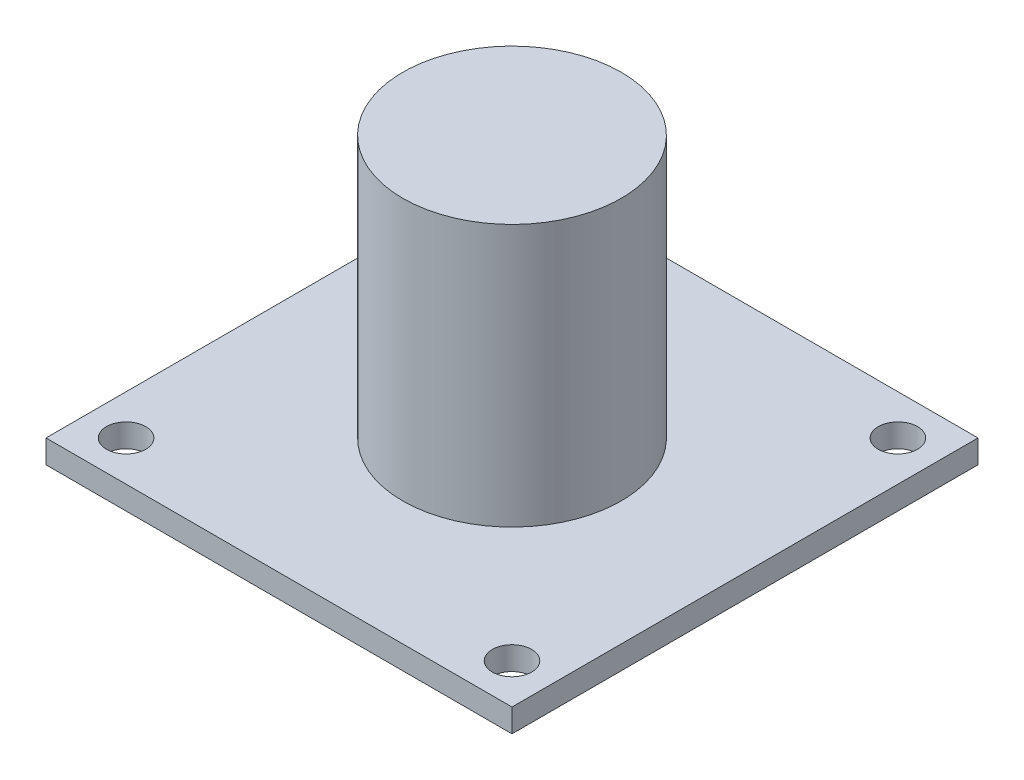
ISO-10303-21;
HEADER;
FILE_DESCRIPTION(('STEP AP214'),'2;1');
FILE_NAME('part.step','',(''),(''),'','','');
FILE_SCHEMA(('AUTOMOTIVE_DESIGN { 1 0 10303 214 1 1 1 1 }'));
ENDSEC;
DATA;
#1=APPLICATION_CONTEXT('core data for automotive mechanical design processes');
#2=APPLICATION_PROTOCOL_DEFINITION('international standard','automotive_design',2000,#1);
#3=PRODUCT_CONTEXT('',#1,'mechanical');
#4=PRODUCT('Part','Part','',(#3));
#5=PRODUCT_RELATED_PRODUCT_CATEGORY('part','',(#4));
#6=PRODUCT_DEFINITION_FORMATION('','',#4);
#7=PRODUCT_DEFINITION_CONTEXT('part definition',#1,'design');
#8=PRODUCT_DEFINITION('design','',#6,#7);
#9=PRODUCT_DEFINITION_SHAPE('','',#8);
#10=(LENGTH_UNIT() NAMED_UNIT(*) SI_UNIT(.MILLI.,.METRE.));
#11=(NAMED_UNIT(*) PLANE_ANGLE_UNIT() SI_UNIT($,.RADIAN.));
#12=(NAMED_UNIT(*) SI_UNIT($,.STERADIAN.) SOLID_ANGLE_UNIT());
#13=UNCERTAINTY_MEASURE_WITH_UNIT(LENGTH_MEASURE(1.E-05),#10,'distance_accuracy_value','');
#14=(GEOMETRIC_REPRESENTATION_CONTEXT(3) GLOBAL_UNCERTAINTY_ASSIGNED_CONTEXT((#13)) GLOBAL_UNIT_ASSIGNED_CONTEXT((#10,
#11,#12)) REPRESENTATION_CONTEXT('',''));
#15=CARTESIAN_POINT('',(0.,0.,0.));
#16=DIRECTION('',(0.,0.,1.));
#17=DIRECTION('',(1.,0.,0.));
#18=AXIS2_PLACEMENT_3D('',#15,#16,#17);
#19=CARTESIAN_POINT('',(0.,1.6,0.));
#20=DIRECTION('',(0.,1.,0.));
#21=DIRECTION('',(0.,0.,1.));
#22=AXIS2_PLACEMENT_3D('',#19,#20,#21);
#23=PLANE('',#22);
#24=CARTESIAN_POINT('',(0.,1.6,0.));
#25=DIRECTION('',(0.,1.,0.));
#26=DIRECTION('',(0.,0.,1.));
#27=AXIS2_PLACEMENT_3D('',#24,#25,#26);
#28=CIRCLE('',#27,7.5);
#29=CARTESIAN_POINT('',(0.,1.6,7.5));
#30=VERTEX_POINT('',#29);
#31=EDGE_CURVE('E162',#30,#30,#28,.T.);
#32=ORIENTED_EDGE('',*,*,#31,.F.);
#33=EDGE_LOOP('',(#32));
#34=FACE_BOUND('',#33,.T.);
#35=CARTESIAN_POINT('',(-13.25,1.6,13.25));
#36=DIRECTION('',(0.,1.,0.));
#37=DIRECTION('',(0.,0.,1.));
#38=AXIS2_PLACEMENT_3D('',#35,#36,#37);
#39=CIRCLE('',#38,1.35);
#40=CARTESIAN_POINT('',(-13.25,1.6,14.6));
#41=VERTEX_POINT('',#40);
#42=EDGE_CURVE('E142',#41,#41,#39,.T.);
#43=ORIENTED_EDGE('',*,*,#42,.F.);
#44=EDGE_LOOP('',(#43));
#45=FACE_BOUND('',#44,.T.);
#46=CARTESIAN_POINT('',(-13.25,1.6,-13.25));
#47=DIRECTION('',(0.,1.,0.));
#48=DIRECTION('',(0.,0.,1.));
#49=AXIS2_PLACEMENT_3D('',#46,#47,#48);
#50=CIRCLE('',#49,1.35);
#51=CARTESIAN_POINT('',(-13.25,1.6,-11.9));
#52=VERTEX_POINT('',#51);
#53=EDGE_CURVE('E112',#52,#52,#50,.T.);
#54=ORIENTED_EDGE('',*,*,#53,.F.);
#55=EDGE_LOOP('',(#54));
#56=FACE_BOUND('',#55,.T.);
#57=DIRECTION('',(0.,0.,-1.));
#58=VECTOR('',#57,1.);
#59=CARTESIAN_POINT('',(16.,1.6,-16.));
#60=LINE('',#59,#58);
#61=CARTESIAN_POINT('',(16.,1.6,16.));
#62=VERTEX_POINT('',#61);
#63=CARTESIAN_POINT('',(16.,1.6,-16.));
#64=VERTEX_POINT('',#63);
#65=EDGE_CURVE('E92',#62,#64,#60,.T.);
#66=ORIENTED_EDGE('',*,*,#65,.T.);
#67=DIRECTION('',(-1.,0.,0.));
#68=VECTOR('',#67,1.);
#69=CARTESIAN_POINT('',(-16.,1.6,-16.));
#70=LINE('',#69,#68);
#71=CARTESIAN_POINT('',(-16.,1.6,-16.));
#72=VERTEX_POINT('',#71);
#73=EDGE_CURVE('E87',#64,#72,#70,.T.);
#74=ORIENTED_EDGE('',*,*,#73,.T.);
#75=DIRECTION('',(0.,0.,1.));
#76=VECTOR('',#75,1.);
#77=CARTESIAN_POINT('',(-16.,1.6,-16.));
#78=LINE('',#77,#76);
#79=CARTESIAN_POINT('',(-16.,1.6,16.));
#80=VERTEX_POINT('',#79);
#81=EDGE_CURVE('E90',#72,#80,#78,.T.);
#82=ORIENTED_EDGE('',*,*,#81,.T.);
#83=DIRECTION('',(1.,0.,0.));
#84=VECTOR('',#83,1.);
#85=CARTESIAN_POINT('',(-16.,1.6,16.));
#86=LINE('',#85,#84);
#87=EDGE_CURVE('E57',#80,#62,#86,.T.);
#88=ORIENTED_EDGE('',*,*,#87,.T.);
#89=EDGE_LOOP('',(#66,#74,#82,#88));
#90=FACE_BOUND('',#89,.T.);
#91=CARTESIAN_POINT('',(13.25,1.6,-13.25));
#92=DIRECTION('',(0.,1.,0.));
#93=DIRECTION('',(0.,0.,1.));
#94=AXIS2_PLACEMENT_3D('',#91,#92,#93);
#95=CIRCLE('',#94,1.35);
#96=CARTESIAN_POINT('',(13.25,1.6,-11.9));
#97=VERTEX_POINT('',#96);
#98=EDGE_CURVE('E134',#97,#97,#95,.T.);
#99=ORIENTED_EDGE('',*,*,#98,.F.);
#100=EDGE_LOOP('',(#99));
#101=FACE_BOUND('',#100,.T.);
#102=CARTESIAN_POINT('',(13.25,1.6,13.25));
#103=DIRECTION('',(0.,1.,0.));
#104=DIRECTION('',(0.,0.,1.));
#105=AXIS2_PLACEMENT_3D('',#102,#103,#104);
#106=CIRCLE('',#105,1.35);
#107=CARTESIAN_POINT('',(13.25,1.6,14.6));
#108=VERTEX_POINT('',#107);
#109=EDGE_CURVE('E150',#108,#108,#106,.T.);
#110=ORIENTED_EDGE('',*,*,#109,.F.);
#111=EDGE_LOOP('',(#110));
#112=FACE_BOUND('',#111,.T.);
#113=ADVANCED_FACE('F39',(#34,#45,#56,#90,#101,#112),#23,.T.);
#114=CARTESIAN_POINT('',(0.,0.,0.));
#115=DIRECTION('',(0.,1.,0.));
#116=DIRECTION('',(0.,0.,1.));
#117=AXIS2_PLACEMENT_3D('',#114,#115,#116);
#118=PLANE('',#117);
#119=DIRECTION('',(0.,0.,-1.));
#120=VECTOR('',#119,1.);
#121=CARTESIAN_POINT('',(16.,0.,-16.));
#122=LINE('',#121,#120);
#123=CARTESIAN_POINT('',(16.,0.,16.));
#124=VERTEX_POINT('',#123);
#125=CARTESIAN_POINT('',(16.,0.,-16.));
#126=VERTEX_POINT('',#125);
#127=EDGE_CURVE('E108',#124,#126,#122,.T.);
#128=ORIENTED_EDGE('',*,*,#127,.F.);
#129=DIRECTION('',(1.,0.,0.));
#130=VECTOR('',#129,1.);
#131=CARTESIAN_POINT('',(-16.,0.,16.));
#132=LINE('',#131,#130);
#133=CARTESIAN_POINT('',(-16.,0.,16.));
#134=VERTEX_POINT('',#133);
#135=EDGE_CURVE('E80',#134,#124,#132,.T.);
#136=ORIENTED_EDGE('',*,*,#135,.F.);
#137=DIRECTION('',(0.,0.,1.));
#138=VECTOR('',#137,1.);
#139=CARTESIAN_POINT('',(-16.,0.,-16.));
#140=LINE('',#139,#138);
#141=CARTESIAN_POINT('',(-16.,0.,-16.));
#142=VERTEX_POINT('',#141);
#143=EDGE_CURVE('E74',#142,#134,#140,.T.);
#144=ORIENTED_EDGE('',*,*,#143,.F.);
#145=DIRECTION('',(-1.,0.,0.));
#146=VECTOR('',#145,1.);
#147=CARTESIAN_POINT('',(-16.,0.,-16.));
#148=LINE('',#147,#146);
#149=EDGE_CURVE('E97',#126,#142,#148,.T.);
#150=ORIENTED_EDGE('',*,*,#149,.F.);
#151=EDGE_LOOP('',(#128,#136,#144,#150));
#152=FACE_BOUND('',#151,.T.);
#153=CARTESIAN_POINT('',(-13.25,0.,-13.25));
#154=DIRECTION('',(0.,1.,0.));
#155=DIRECTION('',(0.,0.,1.));
#156=AXIS2_PLACEMENT_3D('',#153,#154,#155);
#157=CIRCLE('',#156,1.35);
#158=CARTESIAN_POINT('',(-13.25,0.,-11.9));
#159=VERTEX_POINT('',#158);
#160=EDGE_CURVE('E130',#159,#159,#157,.T.);
#161=ORIENTED_EDGE('',*,*,#160,.T.);
#162=EDGE_LOOP('',(#161));
#163=FACE_BOUND('',#162,.T.);
#164=CARTESIAN_POINT('',(13.25,0.,-13.25));
#165=DIRECTION('',(0.,1.,0.));
#166=DIRECTION('',(0.,0.,1.));
#167=AXIS2_PLACEMENT_3D('',#164,#165,#166);
#168=CIRCLE('',#167,1.35);
#169=CARTESIAN_POINT('',(13.25,0.,-11.9));
#170=VERTEX_POINT('',#169);
#171=EDGE_CURVE('E138',#170,#170,#168,.T.);
#172=ORIENTED_EDGE('',*,*,#171,.T.);
#173=EDGE_LOOP('',(#172));
#174=FACE_BOUND('',#173,.T.);
#175=CARTESIAN_POINT('',(-13.25,0.,13.25));
#176=DIRECTION('',(0.,1.,0.));
#177=DIRECTION('',(0.,0.,1.));
#178=AXIS2_PLACEMENT_3D('',#175,#176,#177);
#179=CIRCLE('',#178,1.35);
#180=CARTESIAN_POINT('',(-13.25,0.,14.6));
#181=VERTEX_POINT('',#180);
#182=EDGE_CURVE('E146',#181,#181,#179,.T.);
#183=ORIENTED_EDGE('',*,*,#182,.T.);
#184=EDGE_LOOP('',(#183));
#185=FACE_BOUND('',#184,.T.);
#186=CARTESIAN_POINT('',(13.25,0.,13.25));
#187=DIRECTION('',(0.,1.,0.));
#188=DIRECTION('',(0.,0.,1.));
#189=AXIS2_PLACEMENT_3D('',#186,#187,#188);
#190=CIRCLE('',#189,1.35);
#191=CARTESIAN_POINT('',(13.25,0.,14.6));
#192=VERTEX_POINT('',#191);
#193=EDGE_CURVE('E154',#192,#192,#190,.T.);
#194=ORIENTED_EDGE('',*,*,#193,.T.);
#195=EDGE_LOOP('',(#194));
#196=FACE_BOUND('',#195,.T.);
#197=ADVANCED_FACE('F125',(#152,#163,#174,#185,#196),#118,.F.);
#198=CARTESIAN_POINT('',(16.,1.6,-16.));
#199=DIRECTION('',(-1.,0.,0.));
#200=DIRECTION('',(0.,0.,1.));
#201=AXIS2_PLACEMENT_3D('',#198,#199,#200);
#202=PLANE('',#201);
#203=ORIENTED_EDGE('',*,*,#127,.T.);
#204=DIRECTION('',(0.,-1.,0.));
#205=VECTOR('',#204,1.);
#206=CARTESIAN_POINT('',(16.,1.6,-16.));
#207=LINE('',#206,#205);
#208=EDGE_CURVE('E11',#64,#126,#207,.T.);
#209=ORIENTED_EDGE('',*,*,#208,.F.);
#210=ORIENTED_EDGE('',*,*,#65,.F.);
#211=DIRECTION('',(0.,-1.,0.));
#212=VECTOR('',#211,1.);
#213=CARTESIAN_POINT('',(16.,1.6,16.));
#214=LINE('',#213,#212);
#215=EDGE_CURVE('E104',#62,#124,#214,.T.);
#216=ORIENTED_EDGE('',*,*,#215,.T.);
#217=EDGE_LOOP('',(#203,#209,#210,#216));
#218=FACE_BOUND('',#217,.T.);
#219=ADVANCED_FACE('F41',(#218),#202,.F.);
#220=CARTESIAN_POINT('',(-16.,1.6,-16.));
#221=DIRECTION('',(0.,0.,1.));
#222=DIRECTION('',(1.,0.,0.));
#223=AXIS2_PLACEMENT_3D('',#220,#221,#222);
#224=PLANE('',#223);
#225=ORIENTED_EDGE('',*,*,#149,.T.);
#226=DIRECTION('',(0.,-1.,0.));
#227=VECTOR('',#226,1.);
#228=CARTESIAN_POINT('',(-16.,1.6,-16.));
#229=LINE('',#228,#227);
#230=EDGE_CURVE('E49',#72,#142,#229,.T.);
#231=ORIENTED_EDGE('',*,*,#230,.F.);
#232=ORIENTED_EDGE('',*,*,#73,.F.);
#233=ORIENTED_EDGE('',*,*,#208,.T.);
#234=EDGE_LOOP('',(#225,#231,#232,#233));
#235=FACE_BOUND('',#234,.T.);
#236=ADVANCED_FACE('F96',(#235),#224,.F.);
#237=CARTESIAN_POINT('',(-16.,1.6,-16.));
#238=DIRECTION('',(1.,0.,0.));
#239=DIRECTION('',(0.,0.,-1.));
#240=AXIS2_PLACEMENT_3D('',#237,#238,#239);
#241=PLANE('',#240);
#242=ORIENTED_EDGE('',*,*,#143,.T.);
#243=DIRECTION('',(0.,-1.,0.));
#244=VECTOR('',#243,1.);
#245=CARTESIAN_POINT('',(-16.,1.6,16.));
#246=LINE('',#245,#244);
#247=EDGE_CURVE('E99',#80,#134,#246,.T.);
#248=ORIENTED_EDGE('',*,*,#247,.F.);
#249=ORIENTED_EDGE('',*,*,#81,.F.);
#250=ORIENTED_EDGE('',*,*,#230,.T.);
#251=EDGE_LOOP('',(#242,#248,#249,#250));
#252=FACE_BOUND('',#251,.T.);
#253=ADVANCED_FACE('F100',(#252),#241,.F.);
#254=CARTESIAN_POINT('',(-16.,1.6,16.));
#255=DIRECTION('',(0.,0.,-1.));
#256=DIRECTION('',(-1.,0.,0.));
#257=AXIS2_PLACEMENT_3D('',#254,#255,#256);
#258=PLANE('',#257);
#259=ORIENTED_EDGE('',*,*,#135,.T.);
#260=ORIENTED_EDGE('',*,*,#215,.F.);
#261=ORIENTED_EDGE('',*,*,#87,.F.);
#262=ORIENTED_EDGE('',*,*,#247,.T.);
#263=EDGE_LOOP('',(#259,#260,#261,#262));
#264=FACE_BOUND('',#263,.T.);
#265=ADVANCED_FACE('F122',(#264),#258,.F.);
#266=CARTESIAN_POINT('',(-13.25,1.6,-13.25));
#267=DIRECTION('',(0.,-1.,0.));
#268=DIRECTION('',(0.,0.,-1.));
#269=AXIS2_PLACEMENT_3D('',#266,#267,#268);
#270=CYLINDRICAL_SURFACE('',#269,1.35);
#271=ORIENTED_EDGE('',*,*,#53,.T.);
#272=EDGE_LOOP('',(#271));
#273=FACE_BOUND('',#272,.T.);
#274=ORIENTED_EDGE('',*,*,#160,.F.);
#275=EDGE_LOOP('',(#274));
#276=FACE_BOUND('',#275,.T.);
#277=ADVANCED_FACE('F186',(#273,#276),#270,.F.);
#278=CARTESIAN_POINT('',(13.25,1.6,-13.25));
#279=DIRECTION('',(0.,-1.,0.));
#280=DIRECTION('',(0.,0.,-1.));
#281=AXIS2_PLACEMENT_3D('',#278,#279,#280);
#282=CYLINDRICAL_SURFACE('',#281,1.35);
#283=ORIENTED_EDGE('',*,*,#98,.T.);
#284=EDGE_LOOP('',(#283));
#285=FACE_BOUND('',#284,.T.);
#286=ORIENTED_EDGE('',*,*,#171,.F.);
#287=EDGE_LOOP('',(#286));
#288=FACE_BOUND('',#287,.T.);
#289=ADVANCED_FACE('F189',(#285,#288),#282,.F.);
#290=CARTESIAN_POINT('',(-13.25,1.6,13.25));
#291=DIRECTION('',(0.,-1.,0.));
#292=DIRECTION('',(0.,0.,-1.));
#293=AXIS2_PLACEMENT_3D('',#290,#291,#292);
#294=CYLINDRICAL_SURFACE('',#293,1.35);
#295=ORIENTED_EDGE('',*,*,#42,.T.);
#296=EDGE_LOOP('',(#295));
#297=FACE_BOUND('',#296,.T.);
#298=ORIENTED_EDGE('',*,*,#182,.F.);
#299=EDGE_LOOP('',(#298));
#300=FACE_BOUND('',#299,.T.);
#301=ADVANCED_FACE('F202',(#297,#300),#294,.F.);
#302=CARTESIAN_POINT('',(13.25,1.6,13.25));
#303=DIRECTION('',(0.,-1.,0.));
#304=DIRECTION('',(0.,0.,-1.));
#305=AXIS2_PLACEMENT_3D('',#302,#303,#304);
#306=CYLINDRICAL_SURFACE('',#305,1.35);
#307=ORIENTED_EDGE('',*,*,#109,.T.);
#308=EDGE_LOOP('',(#307));
#309=FACE_BOUND('',#308,.T.);
#310=ORIENTED_EDGE('',*,*,#193,.F.);
#311=EDGE_LOOP('',(#310));
#312=FACE_BOUND('',#311,.T.);
#313=ADVANCED_FACE('F175',(#309,#312),#306,.F.);
#314=CARTESIAN_POINT('',(0.,19.6,0.));
#315=DIRECTION('',(0.,-1.,0.));
#316=DIRECTION('',(0.,0.,-1.));
#317=AXIS2_PLACEMENT_3D('',#314,#315,#316);
#318=CYLINDRICAL_SURFACE('',#317,7.5);
#319=CARTESIAN_POINT('',(0.,19.6,0.));
#320=DIRECTION('',(0.,1.,0.));
#321=DIRECTION('',(0.,0.,1.));
#322=AXIS2_PLACEMENT_3D('',#319,#320,#321);
#323=CIRCLE('',#322,7.5);
#324=CARTESIAN_POINT('',(0.,19.6,7.5));
#325=VERTEX_POINT('',#324);
#326=EDGE_CURVE('E158',#325,#325,#323,.T.);
#327=ORIENTED_EDGE('',*,*,#326,.F.);
#328=EDGE_LOOP('',(#327));
#329=FACE_BOUND('',#328,.T.);
#330=ORIENTED_EDGE('',*,*,#31,.T.);
#331=EDGE_LOOP('',(#330));
#332=FACE_BOUND('',#331,.T.);
#333=ADVANCED_FACE('F172',(#329,#332),#318,.T.);
#334=CARTESIAN_POINT('',(0.,19.6,0.));
#335=DIRECTION('',(0.,1.,0.));
#336=DIRECTION('',(0.,0.,1.));
#337=AXIS2_PLACEMENT_3D('',#334,#335,#336);
#338=PLANE('',#337);
#339=ORIENTED_EDGE('',*,*,#326,.T.);
#340=EDGE_LOOP('',(#339));
#341=FACE_BOUND('',#340,.T.);
#342=ADVANCED_FACE('F170',(#341),#338,.T.);
#343=CLOSED_SHELL('',(#113,#197,#219,#236,#253,#265,#277,#289,#301,#313,#333,#342));
#344=MANIFOLD_SOLID_BREP('B2',#343);
#345=ADVANCED_BREP_SHAPE_REPRESENTATION('',(#18,#344),#14);
#346=SHAPE_DEFINITION_REPRESENTATION(#9,#345);
ENDSEC;
END-ISO-10303-21;
